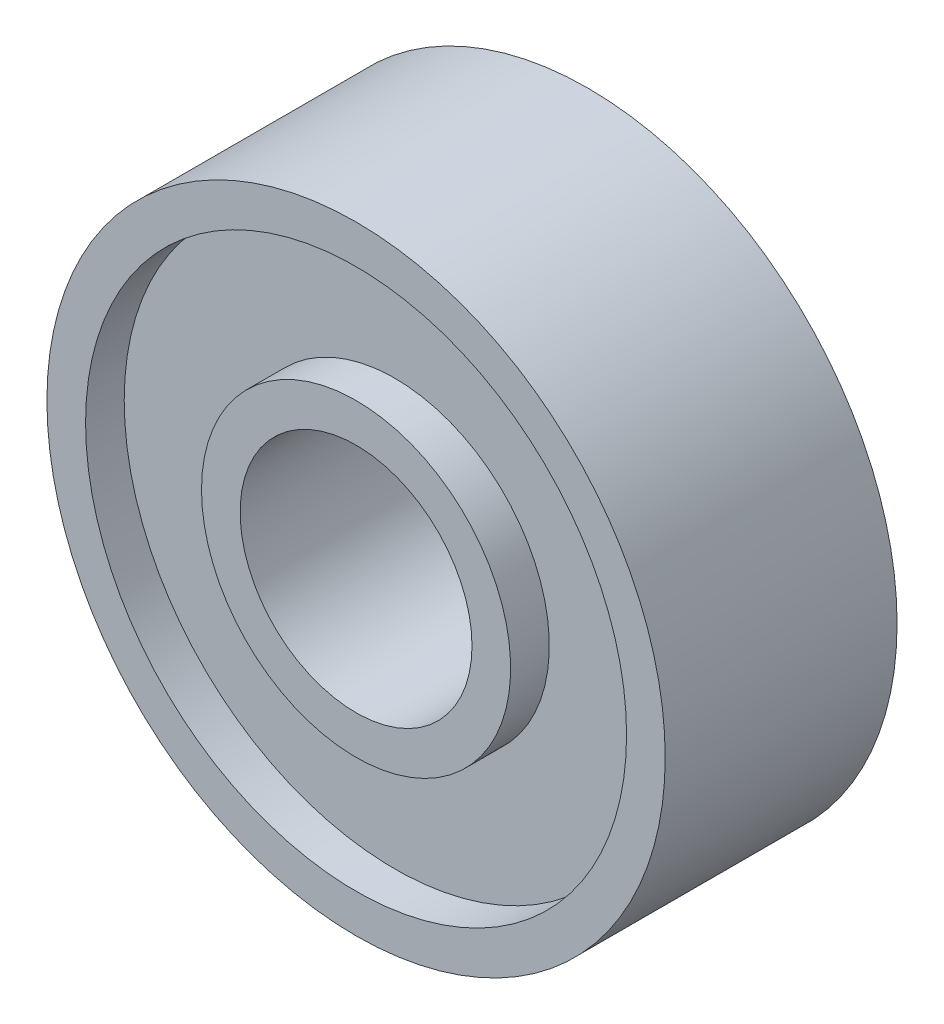
ISO-10303-21;
HEADER;
FILE_DESCRIPTION(('STEP AP214'),'2;1');
FILE_NAME('part.step','',(''),(''),'','','');
FILE_SCHEMA(('AUTOMOTIVE_DESIGN { 1 0 10303 214 1 1 1 1 }'));
ENDSEC;
DATA;
#1=APPLICATION_CONTEXT('core data for automotive mechanical design processes');
#2=APPLICATION_PROTOCOL_DEFINITION('international standard','automotive_design',2000,#1);
#3=PRODUCT_CONTEXT('',#1,'mechanical');
#4=PRODUCT('Part','Part','',(#3));
#5=PRODUCT_RELATED_PRODUCT_CATEGORY('part','',(#4));
#6=PRODUCT_DEFINITION_FORMATION('','',#4);
#7=PRODUCT_DEFINITION_CONTEXT('part definition',#1,'design');
#8=PRODUCT_DEFINITION('design','',#6,#7);
#9=PRODUCT_DEFINITION_SHAPE('','',#8);
#10=(LENGTH_UNIT() NAMED_UNIT(*) SI_UNIT(.MILLI.,.METRE.));
#11=(NAMED_UNIT(*) PLANE_ANGLE_UNIT() SI_UNIT($,.RADIAN.));
#12=(NAMED_UNIT(*) SI_UNIT($,.STERADIAN.) SOLID_ANGLE_UNIT());
#13=UNCERTAINTY_MEASURE_WITH_UNIT(LENGTH_MEASURE(1.E-05),#10,'distance_accuracy_value','');
#14=(GEOMETRIC_REPRESENTATION_CONTEXT(3) GLOBAL_UNCERTAINTY_ASSIGNED_CONTEXT((#13)) GLOBAL_UNIT_ASSIGNED_CONTEXT((#10,
#11,#12)) REPRESENTATION_CONTEXT('',''));
#15=CARTESIAN_POINT('',(0.,0.,0.));
#16=DIRECTION('',(0.,0.,1.));
#17=DIRECTION('',(1.,0.,0.));
#18=AXIS2_PLACEMENT_3D('',#15,#16,#17);
#19=CARTESIAN_POINT('',(0.,0.,-1.5));
#20=DIRECTION('',(0.,0.,1.));
#21=DIRECTION('',(1.,0.,0.));
#22=AXIS2_PLACEMENT_3D('',#19,#20,#21);
#23=PLANE('',#22);
#24=CARTESIAN_POINT('',(0.,0.,-1.5));
#25=DIRECTION('',(0.,0.,1.));
#26=DIRECTION('',(1.,0.,0.));
#27=AXIS2_PLACEMENT_3D('',#24,#25,#26);
#28=CIRCLE('',#27,1.5);
#29=CARTESIAN_POINT('',(1.5,0.,-1.5));
#30=VERTEX_POINT('',#29);
#31=EDGE_CURVE('E59',#30,#30,#28,.T.);
#32=ORIENTED_EDGE('',*,*,#31,.T.);
#33=EDGE_LOOP('',(#32));
#34=FACE_BOUND('',#33,.T.);
#35=CARTESIAN_POINT('',(0.,0.,-1.5));
#36=DIRECTION('',(0.,0.,1.));
#37=DIRECTION('',(1.,0.,0.));
#38=AXIS2_PLACEMENT_3D('',#35,#36,#37);
#39=CIRCLE('',#38,2.);
#40=CARTESIAN_POINT('',(2.,0.,-1.5));
#41=VERTEX_POINT('',#40);
#42=EDGE_CURVE('E68',#41,#41,#39,.T.);
#43=ORIENTED_EDGE('',*,*,#42,.F.);
#44=EDGE_LOOP('',(#43));
#45=FACE_BOUND('',#44,.T.);
#46=ADVANCED_FACE('F43',(#34,#45),#23,.F.);
#47=CARTESIAN_POINT('',(0.,0.,1.5));
#48=DIRECTION('',(0.,0.,1.));
#49=DIRECTION('',(1.,0.,0.));
#50=AXIS2_PLACEMENT_3D('',#47,#48,#49);
#51=PLANE('',#50);
#52=CARTESIAN_POINT('',(0.,0.,1.5));
#53=DIRECTION('',(0.,0.,1.));
#54=DIRECTION('',(1.,0.,0.));
#55=AXIS2_PLACEMENT_3D('',#52,#53,#54);
#56=CIRCLE('',#55,1.5);
#57=CARTESIAN_POINT('',(1.5,0.,1.5));
#58=VERTEX_POINT('',#57);
#59=EDGE_CURVE('E56',#58,#58,#56,.T.);
#60=ORIENTED_EDGE('',*,*,#59,.F.);
#61=EDGE_LOOP('',(#60));
#62=FACE_BOUND('',#61,.T.);
#63=CARTESIAN_POINT('',(0.,0.,1.5));
#64=DIRECTION('',(0.,0.,1.));
#65=DIRECTION('',(1.,0.,0.));
#66=AXIS2_PLACEMENT_3D('',#63,#64,#65);
#67=CIRCLE('',#66,2.);
#68=CARTESIAN_POINT('',(-2.,0.,1.5));
#69=VERTEX_POINT('',#68);
#70=EDGE_CURVE('E62',#69,#69,#67,.F.);
#71=ORIENTED_EDGE('',*,*,#70,.F.);
#72=EDGE_LOOP('',(#71));
#73=FACE_BOUND('',#72,.T.);
#74=ADVANCED_FACE('F110',(#62,#73),#51,.T.);
#75=CARTESIAN_POINT('',(0.,0.,1.5));
#76=DIRECTION('',(0.,0.,1.));
#77=DIRECTION('',(1.,0.,0.));
#78=AXIS2_PLACEMENT_3D('',#75,#76,#77);
#79=CIRCLE('',#78,3.5);
#80=CARTESIAN_POINT('',(-3.5,0.,1.5));
#81=VERTEX_POINT('',#80);
#82=EDGE_CURVE('E65',#81,#81,#79,.F.);
#83=ORIENTED_EDGE('',*,*,#82,.T.);
#84=EDGE_LOOP('',(#83));
#85=FACE_BOUND('',#84,.T.);
#86=CARTESIAN_POINT('',(0.,0.,1.5));
#87=DIRECTION('',(0.,0.,1.));
#88=DIRECTION('',(1.,0.,0.));
#89=AXIS2_PLACEMENT_3D('',#86,#87,#88);
#90=CIRCLE('',#89,4.);
#91=CARTESIAN_POINT('',(4.,0.,1.5));
#92=VERTEX_POINT('',#91);
#93=EDGE_CURVE('E10',#92,#92,#90,.T.);
#94=ORIENTED_EDGE('',*,*,#93,.T.);
#95=EDGE_LOOP('',(#94));
#96=FACE_BOUND('',#95,.T.);
#97=ADVANCED_FACE('F115',(#85,#96),#51,.T.);
#98=CARTESIAN_POINT('',(0.,0.,-1.5));
#99=DIRECTION('',(0.,0.,1.));
#100=DIRECTION('',(1.,0.,0.));
#101=AXIS2_PLACEMENT_3D('',#98,#99,#100);
#102=CIRCLE('',#101,3.5);
#103=CARTESIAN_POINT('',(3.5,0.,-1.5));
#104=VERTEX_POINT('',#103);
#105=EDGE_CURVE('E47',#104,#104,#102,.T.);
#106=ORIENTED_EDGE('',*,*,#105,.T.);
#107=EDGE_LOOP('',(#106));
#108=FACE_BOUND('',#107,.T.);
#109=CARTESIAN_POINT('',(0.,0.,-1.5));
#110=DIRECTION('',(0.,0.,1.));
#111=DIRECTION('',(1.,0.,0.));
#112=AXIS2_PLACEMENT_3D('',#109,#110,#111);
#113=CIRCLE('',#112,4.);
#114=CARTESIAN_POINT('',(4.,0.,-1.5));
#115=VERTEX_POINT('',#114);
#116=EDGE_CURVE('E51',#115,#115,#113,.T.);
#117=ORIENTED_EDGE('',*,*,#116,.F.);
#118=EDGE_LOOP('',(#117));
#119=FACE_BOUND('',#118,.T.);
#120=ADVANCED_FACE('F106',(#108,#119),#23,.F.);
#121=CARTESIAN_POINT('',(0.,0.,1.5));
#122=DIRECTION('',(0.,0.,-1.));
#123=DIRECTION('',(-1.,0.,0.));
#124=AXIS2_PLACEMENT_3D('',#121,#122,#123);
#125=CYLINDRICAL_SURFACE('',#124,4.);
#126=ORIENTED_EDGE('',*,*,#93,.F.);
#127=EDGE_LOOP('',(#126));
#128=FACE_BOUND('',#127,.T.);
#129=ORIENTED_EDGE('',*,*,#116,.T.);
#130=EDGE_LOOP('',(#129));
#131=FACE_BOUND('',#130,.T.);
#132=ADVANCED_FACE('F45',(#128,#131),#125,.T.);
#133=CARTESIAN_POINT('',(0.,0.,1.5));
#134=DIRECTION('',(0.,0.,-1.));
#135=DIRECTION('',(-1.,0.,0.));
#136=AXIS2_PLACEMENT_3D('',#133,#134,#135);
#137=CYLINDRICAL_SURFACE('',#136,1.5);
#138=ORIENTED_EDGE('',*,*,#59,.T.);
#139=EDGE_LOOP('',(#138));
#140=FACE_BOUND('',#139,.T.);
#141=ORIENTED_EDGE('',*,*,#31,.F.);
#142=EDGE_LOOP('',(#141));
#143=FACE_BOUND('',#142,.T.);
#144=ADVANCED_FACE('F94',(#140,#143),#137,.F.);
#145=CARTESIAN_POINT('',(0.,0.,1.500012));
#146=DIRECTION('',(0.,0.,-1.));
#147=DIRECTION('',(-1.,0.,0.));
#148=AXIS2_PLACEMENT_3D('',#145,#146,#147);
#149=CYLINDRICAL_SURFACE('',#148,3.5);
#150=CARTESIAN_POINT('',(0.,0.,1.));
#151=DIRECTION('',(0.,0.,1.));
#152=DIRECTION('',(1.,0.,0.));
#153=AXIS2_PLACEMENT_3D('',#150,#151,#152);
#154=CIRCLE('',#153,3.5);
#155=CARTESIAN_POINT('',(-3.5,0.,1.));
#156=VERTEX_POINT('',#155);
#157=EDGE_CURVE('E66',#156,#156,#154,.T.);
#158=CARTESIAN_POINT('',(-3.5,0.,1.5));
#159=CARTESIAN_POINT('',(-3.5,0.,1.49479166666667));
#160=CARTESIAN_POINT('',(-3.5,0.,1.48958333333333));
#161=CARTESIAN_POINT('',(-3.5,0.,1.47916666666667));
#162=CARTESIAN_POINT('',(-3.5,0.,1.47395833333333));
#163=CARTESIAN_POINT('',(-3.5,0.,1.46354166666667));
#164=CARTESIAN_POINT('',(-3.5,0.,1.45833333333333));
#165=CARTESIAN_POINT('',(-3.5,0.,1.44791666666667));
#166=CARTESIAN_POINT('',(-3.5,0.,1.44270833333333));
#167=CARTESIAN_POINT('',(-3.5,0.,1.43229166666667));
#168=CARTESIAN_POINT('',(-3.5,0.,1.42708333333333));
#169=CARTESIAN_POINT('',(-3.5,0.,1.41666666666667));
#170=CARTESIAN_POINT('',(-3.5,0.,1.41145833333333));
#171=CARTESIAN_POINT('',(-3.5,0.,1.40104166666667));
#172=CARTESIAN_POINT('',(-3.5,0.,1.39583333333333));
#173=CARTESIAN_POINT('',(-3.5,0.,1.38541666666667));
#174=CARTESIAN_POINT('',(-3.5,0.,1.38020833333333));
#175=CARTESIAN_POINT('',(-3.5,0.,1.36979166666667));
#176=CARTESIAN_POINT('',(-3.5,0.,1.36458333333333));
#177=CARTESIAN_POINT('',(-3.5,0.,1.35416666666667));
#178=CARTESIAN_POINT('',(-3.5,0.,1.34895833333333));
#179=CARTESIAN_POINT('',(-3.5,0.,1.33854166666667));
#180=CARTESIAN_POINT('',(-3.5,0.,1.33333333333333));
#181=CARTESIAN_POINT('',(-3.5,0.,1.32291666666667));
#182=CARTESIAN_POINT('',(-3.5,0.,1.31770833333333));
#183=CARTESIAN_POINT('',(-3.5,0.,1.30729166666667));
#184=CARTESIAN_POINT('',(-3.5,0.,1.30208333333333));
#185=CARTESIAN_POINT('',(-3.5,0.,1.29166666666667));
#186=CARTESIAN_POINT('',(-3.5,0.,1.28645833333333));
#187=CARTESIAN_POINT('',(-3.5,0.,1.27604166666667));
#188=CARTESIAN_POINT('',(-3.5,0.,1.27083333333333));
#189=CARTESIAN_POINT('',(-3.5,0.,1.26041666666667));
#190=CARTESIAN_POINT('',(-3.5,0.,1.25520833333333));
#191=CARTESIAN_POINT('',(-3.5,0.,1.24479166666667));
#192=CARTESIAN_POINT('',(-3.5,0.,1.23958333333333));
#193=CARTESIAN_POINT('',(-3.5,0.,1.22916666666667));
#194=CARTESIAN_POINT('',(-3.5,0.,1.22395833333333));
#195=CARTESIAN_POINT('',(-3.5,0.,1.21354166666667));
#196=CARTESIAN_POINT('',(-3.5,0.,1.20833333333333));
#197=CARTESIAN_POINT('',(-3.5,0.,1.19791666666667));
#198=CARTESIAN_POINT('',(-3.5,0.,1.19270833333333));
#199=CARTESIAN_POINT('',(-3.5,0.,1.18229166666667));
#200=CARTESIAN_POINT('',(-3.5,0.,1.17708333333333));
#201=CARTESIAN_POINT('',(-3.5,0.,1.16666666666667));
#202=CARTESIAN_POINT('',(-3.5,0.,1.16145833333333));
#203=CARTESIAN_POINT('',(-3.5,0.,1.15104166666667));
#204=CARTESIAN_POINT('',(-3.5,0.,1.14583333333333));
#205=CARTESIAN_POINT('',(-3.5,0.,1.13541666666667));
#206=CARTESIAN_POINT('',(-3.5,0.,1.13020833333333));
#207=CARTESIAN_POINT('',(-3.5,0.,1.11979166666667));
#208=CARTESIAN_POINT('',(-3.5,0.,1.11458333333333));
#209=CARTESIAN_POINT('',(-3.5,0.,1.10416666666667));
#210=CARTESIAN_POINT('',(-3.5,0.,1.09895833333333));
#211=CARTESIAN_POINT('',(-3.5,0.,1.08854166666667));
#212=CARTESIAN_POINT('',(-3.5,0.,1.08333333333333));
#213=CARTESIAN_POINT('',(-3.5,0.,1.07291666666667));
#214=CARTESIAN_POINT('',(-3.5,0.,1.06770833333333));
#215=CARTESIAN_POINT('',(-3.5,0.,1.05729166666667));
#216=CARTESIAN_POINT('',(-3.5,0.,1.05208333333333));
#217=CARTESIAN_POINT('',(-3.5,0.,1.04166666666667));
#218=CARTESIAN_POINT('',(-3.5,0.,1.03645833333333));
#219=CARTESIAN_POINT('',(-3.5,0.,1.02604166666667));
#220=CARTESIAN_POINT('',(-3.5,0.,1.02083333333333));
#221=CARTESIAN_POINT('',(-3.5,0.,1.01041666666667));
#222=CARTESIAN_POINT('',(-3.5,0.,1.00520833333333));
#223=CARTESIAN_POINT('',(-3.5,0.,1.));
#224=B_SPLINE_CURVE_WITH_KNOTS('',3,(#158,#159,#160,#161,#162,#163,#164,#165,#166,#167,#168,
#169,#170,#171,#172,#173,#174,#175,#176,#177,#178,#179,#180,#181,#182,#183,#184,#185,#186,#187,
#188,#189,#190,#191,#192,#193,#194,#195,#196,#197,#198,#199,#200,#201,#202,#203,#204,#205,#206,
#207,#208,#209,#210,#211,#212,#213,#214,#215,#216,#217,#218,#219,#220,#221,#222,#223),
.UNSPECIFIED.,.F.,.F.,(4,2,2,2,2,2,2,2,2,2,2,2,2,2,2,2,2,2,2,2,2,2,2,2,2,2,2,2,2,2,2,2,4),(0.,
0.0156249999999998,0.0312499999999998,0.0468749999999998,0.0624999999999998,0.0781249999999998,
0.0937499999999999,0.109375,0.125,0.140625,0.15625,0.171875,0.1875,0.203125,0.21875,0.234375,
0.25,0.265625,0.28125,0.296875,0.3125,0.328125,0.34375,0.359375,0.375,0.390625,0.40625,0.421875,
0.4375,0.453125,0.46875,0.484375,0.5),.UNSPECIFIED.);
#225=EDGE_CURVE('BSEAM96',#81,#156,#224,.T.);
#226=ORIENTED_EDGE('',*,*,#82,.F.);
#227=ORIENTED_EDGE('',*,*,#157,.F.);
#228=ORIENTED_EDGE('',*,*,#225,.T.);
#229=ORIENTED_EDGE('',*,*,#225,.F.);
#230=EDGE_LOOP('',(#226,#228,#227,#229));
#231=FACE_BOUND('',#230,.T.);
#232=ADVANCED_FACE('F96',(#231),#149,.F.);
#233=CARTESIAN_POINT('',(0.,0.,1.500012));
#234=DIRECTION('',(0.,0.,-1.));
#235=DIRECTION('',(-1.,0.,0.));
#236=AXIS2_PLACEMENT_3D('',#233,#234,#235);
#237=CYLINDRICAL_SURFACE('',#236,2.);
#238=CARTESIAN_POINT('',(0.,0.,1.));
#239=DIRECTION('',(0.,0.,1.));
#240=DIRECTION('',(1.,0.,0.));
#241=AXIS2_PLACEMENT_3D('',#238,#239,#240);
#242=CIRCLE('',#241,2.);
#243=CARTESIAN_POINT('',(-2.,0.,1.));
#244=VERTEX_POINT('',#243);
#245=EDGE_CURVE('E74',#244,#244,#242,.T.);
#246=CARTESIAN_POINT('',(-2.,0.,1.5));
#247=CARTESIAN_POINT('',(-2.,0.,1.49479166666667));
#248=CARTESIAN_POINT('',(-2.,0.,1.48958333333333));
#249=CARTESIAN_POINT('',(-2.,0.,1.47916666666667));
#250=CARTESIAN_POINT('',(-2.,0.,1.47395833333333));
#251=CARTESIAN_POINT('',(-2.,0.,1.46354166666667));
#252=CARTESIAN_POINT('',(-2.,0.,1.45833333333333));
#253=CARTESIAN_POINT('',(-2.,0.,1.44791666666667));
#254=CARTESIAN_POINT('',(-2.,0.,1.44270833333333));
#255=CARTESIAN_POINT('',(-2.,0.,1.43229166666667));
#256=CARTESIAN_POINT('',(-2.,0.,1.42708333333333));
#257=CARTESIAN_POINT('',(-2.,0.,1.41666666666667));
#258=CARTESIAN_POINT('',(-2.,0.,1.41145833333333));
#259=CARTESIAN_POINT('',(-2.,0.,1.40104166666667));
#260=CARTESIAN_POINT('',(-2.,0.,1.39583333333333));
#261=CARTESIAN_POINT('',(-2.,0.,1.38541666666667));
#262=CARTESIAN_POINT('',(-2.,0.,1.38020833333333));
#263=CARTESIAN_POINT('',(-2.,0.,1.36979166666667));
#264=CARTESIAN_POINT('',(-2.,0.,1.36458333333333));
#265=CARTESIAN_POINT('',(-2.,0.,1.35416666666667));
#266=CARTESIAN_POINT('',(-2.,0.,1.34895833333333));
#267=CARTESIAN_POINT('',(-2.,0.,1.33854166666667));
#268=CARTESIAN_POINT('',(-2.,0.,1.33333333333333));
#269=CARTESIAN_POINT('',(-2.,0.,1.32291666666667));
#270=CARTESIAN_POINT('',(-2.,0.,1.31770833333333));
#271=CARTESIAN_POINT('',(-2.,0.,1.30729166666667));
#272=CARTESIAN_POINT('',(-2.,0.,1.30208333333333));
#273=CARTESIAN_POINT('',(-2.,0.,1.29166666666667));
#274=CARTESIAN_POINT('',(-2.,0.,1.28645833333333));
#275=CARTESIAN_POINT('',(-2.,0.,1.27604166666667));
#276=CARTESIAN_POINT('',(-2.,0.,1.27083333333333));
#277=CARTESIAN_POINT('',(-2.,0.,1.26041666666667));
#278=CARTESIAN_POINT('',(-2.,0.,1.25520833333333));
#279=CARTESIAN_POINT('',(-2.,0.,1.24479166666667));
#280=CARTESIAN_POINT('',(-2.,0.,1.23958333333333));
#281=CARTESIAN_POINT('',(-2.,0.,1.22916666666667));
#282=CARTESIAN_POINT('',(-2.,0.,1.22395833333333));
#283=CARTESIAN_POINT('',(-2.,0.,1.21354166666667));
#284=CARTESIAN_POINT('',(-2.,0.,1.20833333333333));
#285=CARTESIAN_POINT('',(-2.,0.,1.19791666666667));
#286=CARTESIAN_POINT('',(-2.,0.,1.19270833333333));
#287=CARTESIAN_POINT('',(-2.,0.,1.18229166666667));
#288=CARTESIAN_POINT('',(-2.,0.,1.17708333333333));
#289=CARTESIAN_POINT('',(-2.,0.,1.16666666666667));
#290=CARTESIAN_POINT('',(-2.,0.,1.16145833333333));
#291=CARTESIAN_POINT('',(-2.,0.,1.15104166666667));
#292=CARTESIAN_POINT('',(-2.,0.,1.14583333333333));
#293=CARTESIAN_POINT('',(-2.,0.,1.13541666666667));
#294=CARTESIAN_POINT('',(-2.,0.,1.13020833333333));
#295=CARTESIAN_POINT('',(-2.,0.,1.11979166666667));
#296=CARTESIAN_POINT('',(-2.,0.,1.11458333333333));
#297=CARTESIAN_POINT('',(-2.,0.,1.10416666666667));
#298=CARTESIAN_POINT('',(-2.,0.,1.09895833333333));
#299=CARTESIAN_POINT('',(-2.,0.,1.08854166666667));
#300=CARTESIAN_POINT('',(-2.,0.,1.08333333333333));
#301=CARTESIAN_POINT('',(-2.,0.,1.07291666666667));
#302=CARTESIAN_POINT('',(-2.,0.,1.06770833333333));
#303=CARTESIAN_POINT('',(-2.,0.,1.05729166666667));
#304=CARTESIAN_POINT('',(-2.,0.,1.05208333333333));
#305=CARTESIAN_POINT('',(-2.,0.,1.04166666666667));
#306=CARTESIAN_POINT('',(-2.,0.,1.03645833333333));
#307=CARTESIAN_POINT('',(-2.,0.,1.02604166666667));
#308=CARTESIAN_POINT('',(-2.,0.,1.02083333333333));
#309=CARTESIAN_POINT('',(-2.,0.,1.01041666666667));
#310=CARTESIAN_POINT('',(-2.,0.,1.00520833333333));
#311=CARTESIAN_POINT('',(-2.,0.,1.));
#312=B_SPLINE_CURVE_WITH_KNOTS('',3,(#246,#247,#248,#249,#250,#251,#252,#253,#254,#255,#256,
#257,#258,#259,#260,#261,#262,#263,#264,#265,#266,#267,#268,#269,#270,#271,#272,#273,#274,#275,
#276,#277,#278,#279,#280,#281,#282,#283,#284,#285,#286,#287,#288,#289,#290,#291,#292,#293,#294,
#295,#296,#297,#298,#299,#300,#301,#302,#303,#304,#305,#306,#307,#308,#309,#310,#311),
.UNSPECIFIED.,.F.,.F.,(4,2,2,2,2,2,2,2,2,2,2,2,2,2,2,2,2,2,2,2,2,2,2,2,2,2,2,2,2,2,2,2,4),(0.,
0.0156249999999998,0.0312499999999998,0.0468749999999998,0.0624999999999998,0.0781249999999998,
0.0937499999999999,0.109375,0.125,0.140625,0.15625,0.171875,0.1875,0.203125,0.21875,0.234375,
0.25,0.265625,0.28125,0.296875,0.3125,0.328125,0.34375,0.359375,0.375,0.390625,0.40625,0.421875,
0.4375,0.453125,0.46875,0.484375,0.5),.UNSPECIFIED.);
#313=EDGE_CURVE('BSEAM103',#69,#244,#312,.T.);
#314=ORIENTED_EDGE('',*,*,#70,.T.);
#315=ORIENTED_EDGE('',*,*,#245,.T.);
#316=ORIENTED_EDGE('',*,*,#313,.T.);
#317=ORIENTED_EDGE('',*,*,#313,.F.);
#318=EDGE_LOOP('',(#314,#316,#315,#317));
#319=FACE_BOUND('',#318,.T.);
#320=ADVANCED_FACE('F103',(#319),#237,.T.);
#321=CARTESIAN_POINT('',(0.,0.,1.));
#322=DIRECTION('',(0.,0.,1.));
#323=DIRECTION('',(1.,0.,0.));
#324=AXIS2_PLACEMENT_3D('',#321,#322,#323);
#325=PLANE('',#324);
#326=ORIENTED_EDGE('',*,*,#245,.F.);
#327=EDGE_LOOP('',(#326));
#328=FACE_BOUND('',#327,.T.);
#329=ORIENTED_EDGE('',*,*,#157,.T.);
#330=EDGE_LOOP('',(#329));
#331=FACE_BOUND('',#330,.T.);
#332=ADVANCED_FACE('F131',(#328,#331),#325,.T.);
#333=CARTESIAN_POINT('',(0.,0.,-1.500012));
#334=DIRECTION('',(0.,0.,1.));
#335=DIRECTION('',(1.,0.,0.));
#336=AXIS2_PLACEMENT_3D('',#333,#334,#335);
#337=CYLINDRICAL_SURFACE('',#336,3.5);
#338=CARTESIAN_POINT('',(0.,0.,-1.));
#339=DIRECTION('',(0.,0.,1.));
#340=DIRECTION('',(1.,0.,0.));
#341=AXIS2_PLACEMENT_3D('',#338,#339,#340);
#342=CIRCLE('',#341,3.5);
#343=CARTESIAN_POINT('',(3.5,0.,-1.));
#344=VERTEX_POINT('',#343);
#345=EDGE_CURVE('E70',#344,#344,#342,.T.);
#346=CARTESIAN_POINT('',(3.5,0.,-1.));
#347=CARTESIAN_POINT('',(3.5,0.,-1.00520833333333));
#348=CARTESIAN_POINT('',(3.5,0.,-1.01041666666667));
#349=CARTESIAN_POINT('',(3.5,0.,-1.02083333333333));
#350=CARTESIAN_POINT('',(3.5,0.,-1.02604166666667));
#351=CARTESIAN_POINT('',(3.5,0.,-1.03645833333333));
#352=CARTESIAN_POINT('',(3.5,0.,-1.04166666666667));
#353=CARTESIAN_POINT('',(3.5,0.,-1.05208333333333));
#354=CARTESIAN_POINT('',(3.5,0.,-1.05729166666667));
#355=CARTESIAN_POINT('',(3.5,0.,-1.06770833333333));
#356=CARTESIAN_POINT('',(3.5,0.,-1.07291666666667));
#357=CARTESIAN_POINT('',(3.5,0.,-1.08333333333333));
#358=CARTESIAN_POINT('',(3.5,0.,-1.08854166666667));
#359=CARTESIAN_POINT('',(3.5,0.,-1.09895833333333));
#360=CARTESIAN_POINT('',(3.5,0.,-1.10416666666667));
#361=CARTESIAN_POINT('',(3.5,0.,-1.11458333333333));
#362=CARTESIAN_POINT('',(3.5,0.,-1.11979166666667));
#363=CARTESIAN_POINT('',(3.5,0.,-1.13020833333333));
#364=CARTESIAN_POINT('',(3.5,0.,-1.13541666666667));
#365=CARTESIAN_POINT('',(3.5,0.,-1.14583333333333));
#366=CARTESIAN_POINT('',(3.5,0.,-1.15104166666667));
#367=CARTESIAN_POINT('',(3.5,0.,-1.16145833333333));
#368=CARTESIAN_POINT('',(3.5,0.,-1.16666666666667));
#369=CARTESIAN_POINT('',(3.5,0.,-1.17708333333333));
#370=CARTESIAN_POINT('',(3.5,0.,-1.18229166666667));
#371=CARTESIAN_POINT('',(3.5,0.,-1.19270833333333));
#372=CARTESIAN_POINT('',(3.5,0.,-1.19791666666667));
#373=CARTESIAN_POINT('',(3.5,0.,-1.20833333333333));
#374=CARTESIAN_POINT('',(3.5,0.,-1.21354166666667));
#375=CARTESIAN_POINT('',(3.5,0.,-1.22395833333333));
#376=CARTESIAN_POINT('',(3.5,0.,-1.22916666666667));
#377=CARTESIAN_POINT('',(3.5,0.,-1.23958333333333));
#378=CARTESIAN_POINT('',(3.5,0.,-1.24479166666667));
#379=CARTESIAN_POINT('',(3.5,0.,-1.25520833333333));
#380=CARTESIAN_POINT('',(3.5,0.,-1.26041666666667));
#381=CARTESIAN_POINT('',(3.5,0.,-1.27083333333333));
#382=CARTESIAN_POINT('',(3.5,0.,-1.27604166666667));
#383=CARTESIAN_POINT('',(3.5,0.,-1.28645833333333));
#384=CARTESIAN_POINT('',(3.5,0.,-1.29166666666667));
#385=CARTESIAN_POINT('',(3.5,0.,-1.30208333333333));
#386=CARTESIAN_POINT('',(3.5,0.,-1.30729166666667));
#387=CARTESIAN_POINT('',(3.5,0.,-1.31770833333333));
#388=CARTESIAN_POINT('',(3.5,0.,-1.32291666666667));
#389=CARTESIAN_POINT('',(3.5,0.,-1.33333333333333));
#390=CARTESIAN_POINT('',(3.5,0.,-1.33854166666667));
#391=CARTESIAN_POINT('',(3.5,0.,-1.34895833333333));
#392=CARTESIAN_POINT('',(3.5,0.,-1.35416666666667));
#393=CARTESIAN_POINT('',(3.5,0.,-1.36458333333333));
#394=CARTESIAN_POINT('',(3.5,0.,-1.36979166666667));
#395=CARTESIAN_POINT('',(3.5,0.,-1.38020833333333));
#396=CARTESIAN_POINT('',(3.5,0.,-1.38541666666667));
#397=CARTESIAN_POINT('',(3.5,0.,-1.39583333333333));
#398=CARTESIAN_POINT('',(3.5,0.,-1.40104166666667));
#399=CARTESIAN_POINT('',(3.5,0.,-1.41145833333333));
#400=CARTESIAN_POINT('',(3.5,0.,-1.41666666666667));
#401=CARTESIAN_POINT('',(3.5,0.,-1.42708333333333));
#402=CARTESIAN_POINT('',(3.5,0.,-1.43229166666667));
#403=CARTESIAN_POINT('',(3.5,0.,-1.44270833333333));
#404=CARTESIAN_POINT('',(3.5,0.,-1.44791666666667));
#405=CARTESIAN_POINT('',(3.5,0.,-1.45833333333333));
#406=CARTESIAN_POINT('',(3.5,0.,-1.46354166666667));
#407=CARTESIAN_POINT('',(3.5,0.,-1.47395833333333));
#408=CARTESIAN_POINT('',(3.5,0.,-1.47916666666667));
#409=CARTESIAN_POINT('',(3.5,0.,-1.48958333333333));
#410=CARTESIAN_POINT('',(3.5,0.,-1.49479166666667));
#411=CARTESIAN_POINT('',(3.5,0.,-1.5));
#412=B_SPLINE_CURVE_WITH_KNOTS('',3,(#346,#347,#348,#349,#350,#351,#352,#353,#354,#355,#356,
#357,#358,#359,#360,#361,#362,#363,#364,#365,#366,#367,#368,#369,#370,#371,#372,#373,#374,#375,
#376,#377,#378,#379,#380,#381,#382,#383,#384,#385,#386,#387,#388,#389,#390,#391,#392,#393,#394,
#395,#396,#397,#398,#399,#400,#401,#402,#403,#404,#405,#406,#407,#408,#409,#410,#411),
.UNSPECIFIED.,.F.,.F.,(4,2,2,2,2,2,2,2,2,2,2,2,2,2,2,2,2,2,2,2,2,2,2,2,2,2,2,2,2,2,2,2,4),(0.,
0.015625,0.03125,0.046875,0.0625000000000001,0.0781250000000001,0.0937500000000001,0.109375,
0.125,0.140625,0.15625,0.171875,0.1875,0.203125,0.21875,0.234375,0.25,0.265625,0.28125,0.296875,
0.3125,0.328125,0.34375,0.359375,0.375,0.390625,0.40625,0.421875,0.4375,0.453125,0.46875,
0.484375,0.5),.UNSPECIFIED.);
#413=EDGE_CURVE('BSEAM128',#344,#104,#412,.T.);
#414=ORIENTED_EDGE('',*,*,#345,.T.);
#415=ORIENTED_EDGE('',*,*,#105,.F.);
#416=ORIENTED_EDGE('',*,*,#413,.T.);
#417=ORIENTED_EDGE('',*,*,#413,.F.);
#418=EDGE_LOOP('',(#414,#416,#415,#417));
#419=FACE_BOUND('',#418,.T.);
#420=ADVANCED_FACE('F128',(#419),#337,.F.);
#421=CARTESIAN_POINT('',(0.,0.,-1.500012));
#422=DIRECTION('',(0.,0.,1.));
#423=DIRECTION('',(1.,0.,0.));
#424=AXIS2_PLACEMENT_3D('',#421,#422,#423);
#425=CYLINDRICAL_SURFACE('',#424,2.);
#426=CARTESIAN_POINT('',(0.,0.,-1.));
#427=DIRECTION('',(0.,0.,1.));
#428=DIRECTION('',(1.,0.,0.));
#429=AXIS2_PLACEMENT_3D('',#426,#427,#428);
#430=CIRCLE('',#429,2.);
#431=CARTESIAN_POINT('',(2.,0.,-1.));
#432=VERTEX_POINT('',#431);
#433=EDGE_CURVE('E76',#432,#432,#430,.T.);
#434=CARTESIAN_POINT('',(2.,0.,-1.));
#435=CARTESIAN_POINT('',(2.,0.,-1.00520833333333));
#436=CARTESIAN_POINT('',(2.,0.,-1.01041666666667));
#437=CARTESIAN_POINT('',(2.,0.,-1.02083333333333));
#438=CARTESIAN_POINT('',(2.,0.,-1.02604166666667));
#439=CARTESIAN_POINT('',(2.,0.,-1.03645833333333));
#440=CARTESIAN_POINT('',(2.,0.,-1.04166666666667));
#441=CARTESIAN_POINT('',(2.,0.,-1.05208333333333));
#442=CARTESIAN_POINT('',(2.,0.,-1.05729166666667));
#443=CARTESIAN_POINT('',(2.,0.,-1.06770833333333));
#444=CARTESIAN_POINT('',(2.,0.,-1.07291666666667));
#445=CARTESIAN_POINT('',(2.,0.,-1.08333333333333));
#446=CARTESIAN_POINT('',(2.,0.,-1.08854166666667));
#447=CARTESIAN_POINT('',(2.,0.,-1.09895833333333));
#448=CARTESIAN_POINT('',(2.,0.,-1.10416666666667));
#449=CARTESIAN_POINT('',(2.,0.,-1.11458333333333));
#450=CARTESIAN_POINT('',(2.,0.,-1.11979166666667));
#451=CARTESIAN_POINT('',(2.,0.,-1.13020833333333));
#452=CARTESIAN_POINT('',(2.,0.,-1.13541666666667));
#453=CARTESIAN_POINT('',(2.,0.,-1.14583333333333));
#454=CARTESIAN_POINT('',(2.,0.,-1.15104166666667));
#455=CARTESIAN_POINT('',(2.,0.,-1.16145833333333));
#456=CARTESIAN_POINT('',(2.,0.,-1.16666666666667));
#457=CARTESIAN_POINT('',(2.,0.,-1.17708333333333));
#458=CARTESIAN_POINT('',(2.,0.,-1.18229166666667));
#459=CARTESIAN_POINT('',(2.,0.,-1.19270833333333));
#460=CARTESIAN_POINT('',(2.,0.,-1.19791666666667));
#461=CARTESIAN_POINT('',(2.,0.,-1.20833333333333));
#462=CARTESIAN_POINT('',(2.,0.,-1.21354166666667));
#463=CARTESIAN_POINT('',(2.,0.,-1.22395833333333));
#464=CARTESIAN_POINT('',(2.,0.,-1.22916666666667));
#465=CARTESIAN_POINT('',(2.,0.,-1.23958333333333));
#466=CARTESIAN_POINT('',(2.,0.,-1.24479166666667));
#467=CARTESIAN_POINT('',(2.,0.,-1.25520833333333));
#468=CARTESIAN_POINT('',(2.,0.,-1.26041666666667));
#469=CARTESIAN_POINT('',(2.,0.,-1.27083333333333));
#470=CARTESIAN_POINT('',(2.,0.,-1.27604166666667));
#471=CARTESIAN_POINT('',(2.,0.,-1.28645833333333));
#472=CARTESIAN_POINT('',(2.,0.,-1.29166666666667));
#473=CARTESIAN_POINT('',(2.,0.,-1.30208333333333));
#474=CARTESIAN_POINT('',(2.,0.,-1.30729166666667));
#475=CARTESIAN_POINT('',(2.,0.,-1.31770833333333));
#476=CARTESIAN_POINT('',(2.,0.,-1.32291666666667));
#477=CARTESIAN_POINT('',(2.,0.,-1.33333333333333));
#478=CARTESIAN_POINT('',(2.,0.,-1.33854166666667));
#479=CARTESIAN_POINT('',(2.,0.,-1.34895833333333));
#480=CARTESIAN_POINT('',(2.,0.,-1.35416666666667));
#481=CARTESIAN_POINT('',(2.,0.,-1.36458333333333));
#482=CARTESIAN_POINT('',(2.,0.,-1.36979166666667));
#483=CARTESIAN_POINT('',(2.,0.,-1.38020833333333));
#484=CARTESIAN_POINT('',(2.,0.,-1.38541666666667));
#485=CARTESIAN_POINT('',(2.,0.,-1.39583333333333));
#486=CARTESIAN_POINT('',(2.,0.,-1.40104166666667));
#487=CARTESIAN_POINT('',(2.,0.,-1.41145833333333));
#488=CARTESIAN_POINT('',(2.,0.,-1.41666666666667));
#489=CARTESIAN_POINT('',(2.,0.,-1.42708333333333));
#490=CARTESIAN_POINT('',(2.,0.,-1.43229166666667));
#491=CARTESIAN_POINT('',(2.,0.,-1.44270833333333));
#492=CARTESIAN_POINT('',(2.,0.,-1.44791666666667));
#493=CARTESIAN_POINT('',(2.,0.,-1.45833333333333));
#494=CARTESIAN_POINT('',(2.,0.,-1.46354166666667));
#495=CARTESIAN_POINT('',(2.,0.,-1.47395833333333));
#496=CARTESIAN_POINT('',(2.,0.,-1.47916666666667));
#497=CARTESIAN_POINT('',(2.,0.,-1.48958333333333));
#498=CARTESIAN_POINT('',(2.,0.,-1.49479166666667));
#499=CARTESIAN_POINT('',(2.,0.,-1.5));
#500=B_SPLINE_CURVE_WITH_KNOTS('',3,(#434,#435,#436,#437,#438,#439,#440,#441,#442,#443,#444,
#445,#446,#447,#448,#449,#450,#451,#452,#453,#454,#455,#456,#457,#458,#459,#460,#461,#462,#463,
#464,#465,#466,#467,#468,#469,#470,#471,#472,#473,#474,#475,#476,#477,#478,#479,#480,#481,#482,
#483,#484,#485,#486,#487,#488,#489,#490,#491,#492,#493,#494,#495,#496,#497,#498,#499),
.UNSPECIFIED.,.F.,.F.,(4,2,2,2,2,2,2,2,2,2,2,2,2,2,2,2,2,2,2,2,2,2,2,2,2,2,2,2,2,2,2,2,4),(0.,
0.015625,0.03125,0.046875,0.0625000000000001,0.0781250000000001,0.0937500000000001,0.109375,
0.125,0.140625,0.15625,0.171875,0.1875,0.203125,0.21875,0.234375,0.25,0.265625,0.28125,0.296875,
0.3125,0.328125,0.34375,0.359375,0.375,0.390625,0.40625,0.421875,0.4375,0.453125,0.46875,
0.484375,0.5),.UNSPECIFIED.);
#501=EDGE_CURVE('BSEAM130',#432,#41,#500,.T.);
#502=ORIENTED_EDGE('',*,*,#433,.F.);
#503=ORIENTED_EDGE('',*,*,#42,.T.);
#504=ORIENTED_EDGE('',*,*,#501,.T.);
#505=ORIENTED_EDGE('',*,*,#501,.F.);
#506=EDGE_LOOP('',(#502,#504,#503,#505));
#507=FACE_BOUND('',#506,.T.);
#508=ADVANCED_FACE('F130',(#507),#425,.T.);
#509=CARTESIAN_POINT('',(0.,0.,-1.));
#510=DIRECTION('',(0.,0.,-1.));
#511=DIRECTION('',(1.,0.,0.));
#512=AXIS2_PLACEMENT_3D('',#509,#510,#511);
#513=PLANE('',#512);
#514=ORIENTED_EDGE('',*,*,#345,.F.);
#515=EDGE_LOOP('',(#514));
#516=FACE_BOUND('',#515,.T.);
#517=ORIENTED_EDGE('',*,*,#433,.T.);
#518=EDGE_LOOP('',(#517));
#519=FACE_BOUND('',#518,.T.);
#520=ADVANCED_FACE('F137',(#516,#519),#513,.T.);
#521=CLOSED_SHELL('',(#46,#74,#97,#120,#132,#144,#232,#320,#332,#420,#508,#520));
#522=MANIFOLD_SOLID_BREP('B2',#521);
#523=ADVANCED_BREP_SHAPE_REPRESENTATION('',(#18,#522),#14);
#524=SHAPE_DEFINITION_REPRESENTATION(#9,#523);
ENDSEC;
END-ISO-10303-21;
